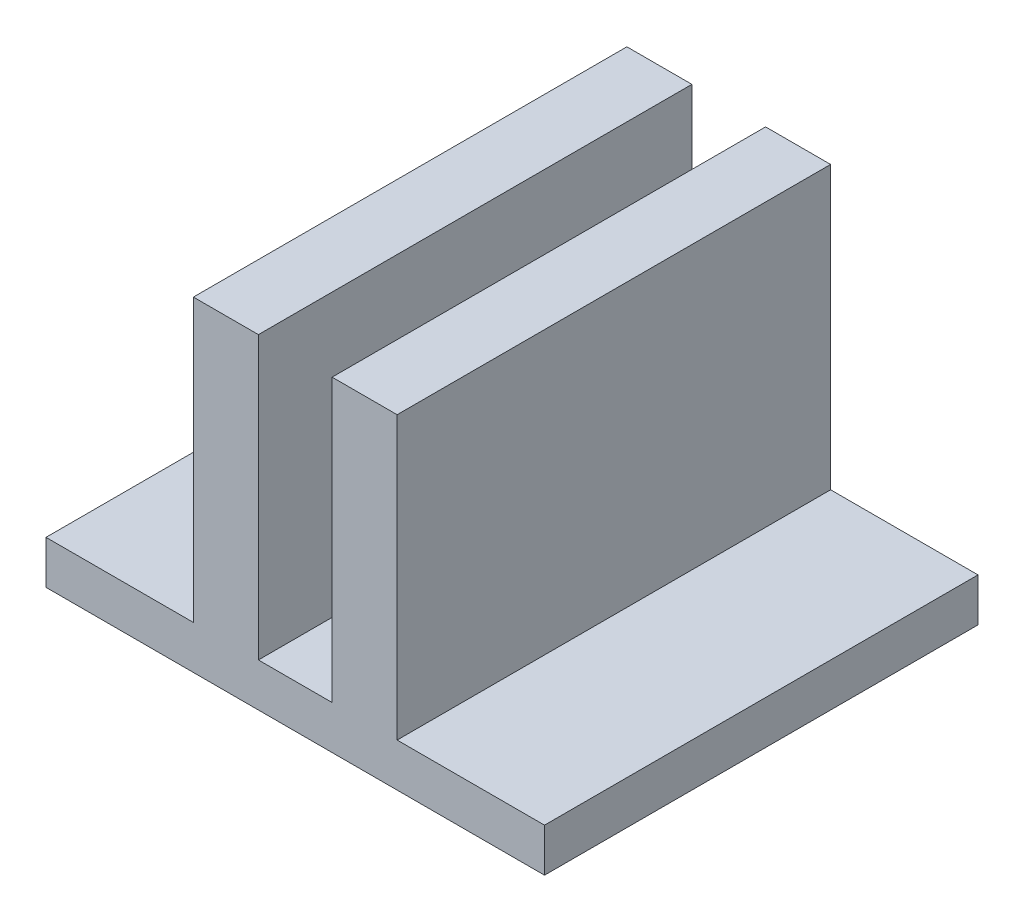
ISO-10303-21;
HEADER;
FILE_DESCRIPTION(('STEP AP214'),'2;1');
FILE_NAME('part.step','',(''),(''),'','','');
FILE_SCHEMA(('AUTOMOTIVE_DESIGN { 1 0 10303 214 1 1 1 1 }'));
ENDSEC;
DATA;
#1=APPLICATION_CONTEXT('core data for automotive mechanical design processes');
#2=APPLICATION_PROTOCOL_DEFINITION('international standard','automotive_design',2000,#1);
#3=PRODUCT_CONTEXT('',#1,'mechanical');
#4=PRODUCT('Part','Part','',(#3));
#5=PRODUCT_RELATED_PRODUCT_CATEGORY('part','',(#4));
#6=PRODUCT_DEFINITION_FORMATION('','',#4);
#7=PRODUCT_DEFINITION_CONTEXT('part definition',#1,'design');
#8=PRODUCT_DEFINITION('design','',#6,#7);
#9=PRODUCT_DEFINITION_SHAPE('','',#8);
#10=(LENGTH_UNIT() NAMED_UNIT(*) SI_UNIT(.MILLI.,.METRE.));
#11=(NAMED_UNIT(*) PLANE_ANGLE_UNIT() SI_UNIT($,.RADIAN.));
#12=(NAMED_UNIT(*) SI_UNIT($,.STERADIAN.) SOLID_ANGLE_UNIT());
#13=UNCERTAINTY_MEASURE_WITH_UNIT(LENGTH_MEASURE(1.E-05),#10,'distance_accuracy_value','');
#14=(GEOMETRIC_REPRESENTATION_CONTEXT(3) GLOBAL_UNCERTAINTY_ASSIGNED_CONTEXT((#13)) GLOBAL_UNIT_ASSIGNED_CONTEXT((#10,
#11,#12)) REPRESENTATION_CONTEXT('',''));
#15=CARTESIAN_POINT('',(0.,0.,0.));
#16=DIRECTION('',(0.,0.,1.));
#17=DIRECTION('',(1.,0.,0.));
#18=AXIS2_PLACEMENT_3D('',#15,#16,#17);
#19=CARTESIAN_POINT('',(0.,15.,0.));
#20=DIRECTION('',(0.,-1.,0.));
#21=DIRECTION('',(0.,0.,-1.));
#22=AXIS2_PLACEMENT_3D('',#19,#20,#21);
#23=PLANE('',#22);
#24=DIRECTION('',(0.,0.,1.));
#25=VECTOR('',#24,1.);
#26=CARTESIAN_POINT('',(-3.59285714285714,15.,-11.1607142857143));
#27=LINE('',#26,#25);
#28=CARTESIAN_POINT('',(-3.59285714285714,15.,-11.1607142857143));
#29=VERTEX_POINT('',#28);
#30=CARTESIAN_POINT('',(-3.59285714285714,15.,8.83928571428572));
#31=VERTEX_POINT('',#30);
#32=EDGE_CURVE('E162',#29,#31,#27,.T.);
#33=ORIENTED_EDGE('',*,*,#32,.F.);
#34=DIRECTION('',(-1.,0.,0.));
#35=VECTOR('',#34,1.);
#36=CARTESIAN_POINT('',(-8.39285714285714,15.,-11.1607142857143));
#37=LINE('',#36,#35);
#38=CARTESIAN_POINT('',(-6.59285714285714,15.,-11.1607142857143));
#39=VERTEX_POINT('',#38);
#40=EDGE_CURVE('E44',#29,#39,#37,.T.);
#41=ORIENTED_EDGE('',*,*,#40,.T.);
#42=DIRECTION('',(0.,0.,-1.));
#43=VECTOR('',#42,1.);
#44=CARTESIAN_POINT('',(-6.59285714285714,15.,8.83928571428572));
#45=LINE('',#44,#43);
#46=CARTESIAN_POINT('',(-6.59285714285714,15.,8.83928571428572));
#47=VERTEX_POINT('',#46);
#48=EDGE_CURVE('E138',#47,#39,#45,.T.);
#49=ORIENTED_EDGE('',*,*,#48,.F.);
#50=DIRECTION('',(1.,0.,0.));
#51=VECTOR('',#50,1.);
#52=CARTESIAN_POINT('',(4.60714285714286,15.,8.83928571428572));
#53=LINE('',#52,#51);
#54=EDGE_CURVE('E127',#47,#31,#53,.T.);
#55=ORIENTED_EDGE('',*,*,#54,.T.);
#56=EDGE_LOOP('',(#33,#41,#49,#55));
#57=FACE_BOUND('',#56,.T.);
#58=ADVANCED_FACE('F35',(#57),#23,.F.);
#59=DIRECTION('',(0.,0.,-1.));
#60=VECTOR('',#59,1.);
#61=CARTESIAN_POINT('',(-0.192857142857143,15.,8.83928571428572));
#62=LINE('',#61,#60);
#63=CARTESIAN_POINT('',(-0.192857142857143,15.,8.83928571428572));
#64=VERTEX_POINT('',#63);
#65=CARTESIAN_POINT('',(-0.192857142857143,15.,-11.1607142857143));
#66=VERTEX_POINT('',#65);
#67=EDGE_CURVE('E170',#64,#66,#62,.T.);
#68=ORIENTED_EDGE('',*,*,#67,.F.);
#69=CARTESIAN_POINT('',(2.80714285714286,15.,8.83928571428572));
#70=VERTEX_POINT('',#69);
#71=EDGE_CURVE('E135',#64,#70,#53,.T.);
#72=ORIENTED_EDGE('',*,*,#71,.T.);
#73=DIRECTION('',(0.,0.,1.));
#74=VECTOR('',#73,1.);
#75=CARTESIAN_POINT('',(2.80714285714286,15.,-11.1607142857143));
#76=LINE('',#75,#74);
#77=CARTESIAN_POINT('',(2.80714285714286,15.,-11.1607142857143));
#78=VERTEX_POINT('',#77);
#79=EDGE_CURVE('E153',#78,#70,#76,.T.);
#80=ORIENTED_EDGE('',*,*,#79,.F.);
#81=EDGE_CURVE('E11',#78,#66,#37,.T.);
#82=ORIENTED_EDGE('',*,*,#81,.T.);
#83=EDGE_LOOP('',(#68,#72,#80,#82));
#84=FACE_BOUND('',#83,.T.);
#85=ADVANCED_FACE('F238',(#84),#23,.F.);
#86=CARTESIAN_POINT('',(4.60714285714286,15.,8.83928571428572));
#87=DIRECTION('',(0.,0.,-1.));
#88=DIRECTION('',(-1.,0.,0.));
#89=AXIS2_PLACEMENT_3D('',#86,#87,#88);
#90=PLANE('',#89);
#91=ORIENTED_EDGE('',*,*,#54,.F.);
#92=DIRECTION('',(0.,1.,0.));
#93=VECTOR('',#92,1.);
#94=CARTESIAN_POINT('',(-6.59285714285714,2.,8.83928571428572));
#95=LINE('',#94,#93);
#96=CARTESIAN_POINT('',(-6.59285714285714,2.,8.83928571428572));
#97=VERTEX_POINT('',#96);
#98=EDGE_CURVE('E130',#97,#47,#95,.T.);
#99=ORIENTED_EDGE('',*,*,#98,.F.);
#100=DIRECTION('',(1.,0.,0.));
#101=VECTOR('',#100,1.);
#102=CARTESIAN_POINT('',(0.,2.,8.83928571428572));
#103=LINE('',#102,#101);
#104=CARTESIAN_POINT('',(-13.3928571428571,2.,8.83928571428572));
#105=VERTEX_POINT('',#104);
#106=EDGE_CURVE('E205',#105,#97,#103,.T.);
#107=ORIENTED_EDGE('',*,*,#106,.F.);
#108=DIRECTION('',(0.,1.,0.));
#109=VECTOR('',#108,1.);
#110=CARTESIAN_POINT('',(-13.3928571428571,0.,8.83928571428572));
#111=LINE('',#110,#109);
#112=CARTESIAN_POINT('',(-13.3928571428571,0.,8.83928571428572));
#113=VERTEX_POINT('',#112);
#114=EDGE_CURVE('E190',#113,#105,#111,.T.);
#115=ORIENTED_EDGE('',*,*,#114,.F.);
#116=DIRECTION('',(1.,0.,0.));
#117=VECTOR('',#116,1.);
#118=CARTESIAN_POINT('',(4.60714285714286,0.,8.83928571428572));
#119=LINE('',#118,#117);
#120=CARTESIAN_POINT('',(9.60714285714286,0.,8.83928571428572));
#121=VERTEX_POINT('',#120);
#122=EDGE_CURVE('E208',#113,#121,#119,.T.);
#123=ORIENTED_EDGE('',*,*,#122,.T.);
#124=DIRECTION('',(0.,-1.,0.));
#125=VECTOR('',#124,1.);
#126=CARTESIAN_POINT('',(9.60714285714286,2.,8.83928571428572));
#127=LINE('',#126,#125);
#128=CARTESIAN_POINT('',(9.60714285714286,2.,8.83928571428572));
#129=VERTEX_POINT('',#128);
#130=EDGE_CURVE('E184',#129,#121,#127,.T.);
#131=ORIENTED_EDGE('',*,*,#130,.F.);
#132=DIRECTION('',(1.,0.,0.));
#133=VECTOR('',#132,1.);
#134=CARTESIAN_POINT('',(0.,2.,8.83928571428572));
#135=LINE('',#134,#133);
#136=CARTESIAN_POINT('',(2.80714285714286,2.,8.83928571428572));
#137=VERTEX_POINT('',#136);
#138=EDGE_CURVE('E211',#137,#129,#135,.T.);
#139=ORIENTED_EDGE('',*,*,#138,.F.);
#140=DIRECTION('',(0.,-1.,0.));
#141=VECTOR('',#140,1.);
#142=CARTESIAN_POINT('',(2.80714285714286,15.,8.83928571428572));
#143=LINE('',#142,#141);
#144=EDGE_CURVE('E156',#70,#137,#143,.T.);
#145=ORIENTED_EDGE('',*,*,#144,.F.);
#146=ORIENTED_EDGE('',*,*,#71,.F.);
#147=DIRECTION('',(0.,1.,0.));
#148=VECTOR('',#147,1.);
#149=CARTESIAN_POINT('',(-0.192857142857143,2.,8.83928571428572));
#150=LINE('',#149,#148);
#151=CARTESIAN_POINT('',(-0.192857142857143,2.,8.83928571428572));
#152=VERTEX_POINT('',#151);
#153=EDGE_CURVE('E168',#152,#64,#150,.T.);
#154=ORIENTED_EDGE('',*,*,#153,.F.);
#155=DIRECTION('',(1.,0.,0.));
#156=VECTOR('',#155,1.);
#157=CARTESIAN_POINT('',(0.,2.,8.83928571428572));
#158=LINE('',#157,#156);
#159=CARTESIAN_POINT('',(-3.59285714285714,2.,8.83928571428572));
#160=VERTEX_POINT('',#159);
#161=EDGE_CURVE('E206',#160,#152,#158,.T.);
#162=ORIENTED_EDGE('',*,*,#161,.F.);
#163=DIRECTION('',(0.,-1.,0.));
#164=VECTOR('',#163,1.);
#165=CARTESIAN_POINT('',(-3.59285714285714,15.,8.83928571428572));
#166=LINE('',#165,#164);
#167=EDGE_CURVE('E132',#31,#160,#166,.T.);
#168=ORIENTED_EDGE('',*,*,#167,.F.);
#169=EDGE_LOOP('',(#91,#99,#107,#115,#123,#131,#139,#145,#146,#154,#162,#168));
#170=FACE_BOUND('',#169,.T.);
#171=ADVANCED_FACE('F37',(#170),#90,.F.);
#172=CARTESIAN_POINT('',(-8.39285714285714,15.,-11.1607142857143));
#173=DIRECTION('',(0.,0.,1.));
#174=DIRECTION('',(1.,0.,0.));
#175=AXIS2_PLACEMENT_3D('',#172,#173,#174);
#176=PLANE('',#175);
#177=DIRECTION('',(0.,-1.,0.));
#178=VECTOR('',#177,1.);
#179=CARTESIAN_POINT('',(-6.59285714285714,15.,-11.1607142857143));
#180=LINE('',#179,#178);
#181=CARTESIAN_POINT('',(-6.59285714285714,2.,-11.1607142857143));
#182=VERTEX_POINT('',#181);
#183=EDGE_CURVE('E143',#39,#182,#180,.T.);
#184=ORIENTED_EDGE('',*,*,#183,.F.);
#185=ORIENTED_EDGE('',*,*,#40,.F.);
#186=DIRECTION('',(0.,1.,0.));
#187=VECTOR('',#186,1.);
#188=CARTESIAN_POINT('',(-3.59285714285714,2.,-11.1607142857143));
#189=LINE('',#188,#187);
#190=CARTESIAN_POINT('',(-3.59285714285714,2.,-11.1607142857143));
#191=VERTEX_POINT('',#190);
#192=EDGE_CURVE('E160',#191,#29,#189,.T.);
#193=ORIENTED_EDGE('',*,*,#192,.F.);
#194=DIRECTION('',(-1.,0.,0.));
#195=VECTOR('',#194,1.);
#196=CARTESIAN_POINT('',(0.,2.,-11.1607142857143));
#197=LINE('',#196,#195);
#198=CARTESIAN_POINT('',(-0.192857142857143,2.,-11.1607142857143));
#199=VERTEX_POINT('',#198);
#200=EDGE_CURVE('E209',#199,#191,#197,.T.);
#201=ORIENTED_EDGE('',*,*,#200,.F.);
#202=DIRECTION('',(0.,-1.,0.));
#203=VECTOR('',#202,1.);
#204=CARTESIAN_POINT('',(-0.192857142857143,15.,-11.1607142857143));
#205=LINE('',#204,#203);
#206=EDGE_CURVE('E172',#66,#199,#205,.T.);
#207=ORIENTED_EDGE('',*,*,#206,.F.);
#208=ORIENTED_EDGE('',*,*,#81,.F.);
#209=DIRECTION('',(0.,1.,0.));
#210=VECTOR('',#209,1.);
#211=CARTESIAN_POINT('',(2.80714285714286,2.,-11.1607142857143));
#212=LINE('',#211,#210);
#213=CARTESIAN_POINT('',(2.80714285714286,2.,-11.1607142857143));
#214=VERTEX_POINT('',#213);
#215=EDGE_CURVE('E150',#214,#78,#212,.T.);
#216=ORIENTED_EDGE('',*,*,#215,.F.);
#217=DIRECTION('',(-1.,0.,0.));
#218=VECTOR('',#217,1.);
#219=CARTESIAN_POINT('',(0.,2.,-11.1607142857143));
#220=LINE('',#219,#218);
#221=CARTESIAN_POINT('',(9.60714285714286,2.,-11.1607142857143));
#222=VERTEX_POINT('',#221);
#223=EDGE_CURVE('E202',#222,#214,#220,.T.);
#224=ORIENTED_EDGE('',*,*,#223,.F.);
#225=DIRECTION('',(0.,1.,0.));
#226=VECTOR('',#225,1.);
#227=CARTESIAN_POINT('',(9.60714285714286,0.,-11.1607142857143));
#228=LINE('',#227,#226);
#229=CARTESIAN_POINT('',(9.60714285714286,0.,-11.1607142857143));
#230=VERTEX_POINT('',#229);
#231=EDGE_CURVE('E178',#230,#222,#228,.T.);
#232=ORIENTED_EDGE('',*,*,#231,.F.);
#233=DIRECTION('',(-1.,0.,0.));
#234=VECTOR('',#233,1.);
#235=CARTESIAN_POINT('',(-8.39285714285714,0.,-11.1607142857143));
#236=LINE('',#235,#234);
#237=CARTESIAN_POINT('',(-13.3928571428571,0.,-11.1607142857143));
#238=VERTEX_POINT('',#237);
#239=EDGE_CURVE('E39',#230,#238,#236,.T.);
#240=ORIENTED_EDGE('',*,*,#239,.T.);
#241=DIRECTION('',(0.,-1.,0.));
#242=VECTOR('',#241,1.);
#243=CARTESIAN_POINT('',(-13.3928571428571,2.,-11.1607142857143));
#244=LINE('',#243,#242);
#245=CARTESIAN_POINT('',(-13.3928571428571,2.,-11.1607142857143));
#246=VERTEX_POINT('',#245);
#247=EDGE_CURVE('E196',#246,#238,#244,.T.);
#248=ORIENTED_EDGE('',*,*,#247,.F.);
#249=DIRECTION('',(-1.,0.,0.));
#250=VECTOR('',#249,1.);
#251=CARTESIAN_POINT('',(0.,2.,-11.1607142857143));
#252=LINE('',#251,#250);
#253=EDGE_CURVE('E203',#182,#246,#252,.T.);
#254=ORIENTED_EDGE('',*,*,#253,.F.);
#255=EDGE_LOOP('',(#184,#185,#193,#201,#207,#208,#216,#224,#232,#240,#248,#254));
#256=FACE_BOUND('',#255,.T.);
#257=ADVANCED_FACE('F219',(#256),#176,.F.);
#258=CARTESIAN_POINT('',(0.,0.,0.));
#259=DIRECTION('',(0.,-1.,0.));
#260=DIRECTION('',(0.,0.,-1.));
#261=AXIS2_PLACEMENT_3D('',#258,#259,#260);
#262=PLANE('',#261);
#263=ORIENTED_EDGE('',*,*,#122,.F.);
#264=DIRECTION('',(0.,0.,1.));
#265=VECTOR('',#264,1.);
#266=CARTESIAN_POINT('',(-13.3928571428571,0.,-11.1607142857143));
#267=LINE('',#266,#265);
#268=EDGE_CURVE('E199',#238,#113,#267,.T.);
#269=ORIENTED_EDGE('',*,*,#268,.F.);
#270=ORIENTED_EDGE('',*,*,#239,.F.);
#271=DIRECTION('',(0.,0.,-1.));
#272=VECTOR('',#271,1.);
#273=CARTESIAN_POINT('',(9.60714285714286,0.,8.83928571428572));
#274=LINE('',#273,#272);
#275=EDGE_CURVE('E187',#121,#230,#274,.T.);
#276=ORIENTED_EDGE('',*,*,#275,.F.);
#277=EDGE_LOOP('',(#263,#269,#270,#276));
#278=FACE_BOUND('',#277,.T.);
#279=ADVANCED_FACE('F226',(#278),#262,.T.);
#280=CARTESIAN_POINT('',(0.,2.,0.));
#281=DIRECTION('',(0.,1.,0.));
#282=DIRECTION('',(0.,0.,1.));
#283=AXIS2_PLACEMENT_3D('',#280,#281,#282);
#284=PLANE('',#283);
#285=DIRECTION('',(0.,0.,-1.));
#286=VECTOR('',#285,1.);
#287=CARTESIAN_POINT('',(2.80714285714286,2.,8.83928571428572));
#288=LINE('',#287,#286);
#289=EDGE_CURVE('E60',#137,#214,#288,.T.);
#290=ORIENTED_EDGE('',*,*,#289,.F.);
#291=ORIENTED_EDGE('',*,*,#138,.T.);
#292=DIRECTION('',(0.,0.,1.));
#293=VECTOR('',#292,1.);
#294=CARTESIAN_POINT('',(9.60714285714286,2.,-11.1607142857143));
#295=LINE('',#294,#293);
#296=EDGE_CURVE('E181',#222,#129,#295,.T.);
#297=ORIENTED_EDGE('',*,*,#296,.F.);
#298=ORIENTED_EDGE('',*,*,#223,.T.);
#299=EDGE_LOOP('',(#290,#291,#297,#298));
#300=FACE_BOUND('',#299,.T.);
#301=ADVANCED_FACE('F260',(#300),#284,.T.);
#302=CARTESIAN_POINT('',(0.,2.,0.));
#303=DIRECTION('',(0.,1.,0.));
#304=DIRECTION('',(0.,0.,1.));
#305=AXIS2_PLACEMENT_3D('',#302,#303,#304);
#306=PLANE('',#305);
#307=ORIENTED_EDGE('',*,*,#161,.T.);
#308=DIRECTION('',(0.,0.,1.));
#309=VECTOR('',#308,1.);
#310=CARTESIAN_POINT('',(-0.192857142857143,2.,-11.1607142857143));
#311=LINE('',#310,#309);
#312=EDGE_CURVE('E175',#199,#152,#311,.T.);
#313=ORIENTED_EDGE('',*,*,#312,.F.);
#314=ORIENTED_EDGE('',*,*,#200,.T.);
#315=DIRECTION('',(0.,0.,-1.));
#316=VECTOR('',#315,1.);
#317=CARTESIAN_POINT('',(-3.59285714285714,2.,8.83928571428572));
#318=LINE('',#317,#316);
#319=EDGE_CURVE('E165',#160,#191,#318,.T.);
#320=ORIENTED_EDGE('',*,*,#319,.F.);
#321=EDGE_LOOP('',(#307,#313,#314,#320));
#322=FACE_BOUND('',#321,.T.);
#323=ADVANCED_FACE('F245',(#322),#306,.T.);
#324=CARTESIAN_POINT('',(0.,2.,0.));
#325=DIRECTION('',(0.,1.,0.));
#326=DIRECTION('',(0.,0.,1.));
#327=AXIS2_PLACEMENT_3D('',#324,#325,#326);
#328=PLANE('',#327);
#329=DIRECTION('',(0.,0.,1.));
#330=VECTOR('',#329,1.);
#331=CARTESIAN_POINT('',(-6.59285714285714,2.,-11.1607142857143));
#332=LINE('',#331,#330);
#333=EDGE_CURVE('E52',#182,#97,#332,.T.);
#334=ORIENTED_EDGE('',*,*,#333,.F.);
#335=ORIENTED_EDGE('',*,*,#253,.T.);
#336=DIRECTION('',(0.,0.,-1.));
#337=VECTOR('',#336,1.);
#338=CARTESIAN_POINT('',(-13.3928571428571,2.,8.83928571428572));
#339=LINE('',#338,#337);
#340=EDGE_CURVE('E193',#105,#246,#339,.T.);
#341=ORIENTED_EDGE('',*,*,#340,.F.);
#342=ORIENTED_EDGE('',*,*,#106,.T.);
#343=EDGE_LOOP('',(#334,#335,#341,#342));
#344=FACE_BOUND('',#343,.T.);
#345=ADVANCED_FACE('F250',(#344),#328,.T.);
#346=CARTESIAN_POINT('',(-13.3928571428571,0.,0.));
#347=DIRECTION('',(-1.,0.,0.));
#348=DIRECTION('',(0.,0.,1.));
#349=AXIS2_PLACEMENT_3D('',#346,#347,#348);
#350=PLANE('',#349);
#351=ORIENTED_EDGE('',*,*,#114,.T.);
#352=ORIENTED_EDGE('',*,*,#340,.T.);
#353=ORIENTED_EDGE('',*,*,#247,.T.);
#354=ORIENTED_EDGE('',*,*,#268,.T.);
#355=EDGE_LOOP('',(#351,#352,#353,#354));
#356=FACE_BOUND('',#355,.T.);
#357=ADVANCED_FACE('F224',(#356),#350,.T.);
#358=CARTESIAN_POINT('',(9.60714285714286,0.,0.));
#359=DIRECTION('',(1.,0.,0.));
#360=DIRECTION('',(0.,0.,-1.));
#361=AXIS2_PLACEMENT_3D('',#358,#359,#360);
#362=PLANE('',#361);
#363=ORIENTED_EDGE('',*,*,#231,.T.);
#364=ORIENTED_EDGE('',*,*,#296,.T.);
#365=ORIENTED_EDGE('',*,*,#130,.T.);
#366=ORIENTED_EDGE('',*,*,#275,.T.);
#367=EDGE_LOOP('',(#363,#364,#365,#366));
#368=FACE_BOUND('',#367,.T.);
#369=ADVANCED_FACE('F228',(#368),#362,.T.);
#370=CARTESIAN_POINT('',(-0.192857142857143,0.,0.));
#371=DIRECTION('',(-1.,0.,0.));
#372=DIRECTION('',(0.,0.,1.));
#373=AXIS2_PLACEMENT_3D('',#370,#371,#372);
#374=PLANE('',#373);
#375=ORIENTED_EDGE('',*,*,#153,.T.);
#376=ORIENTED_EDGE('',*,*,#67,.T.);
#377=ORIENTED_EDGE('',*,*,#206,.T.);
#378=ORIENTED_EDGE('',*,*,#312,.T.);
#379=EDGE_LOOP('',(#375,#376,#377,#378));
#380=FACE_BOUND('',#379,.T.);
#381=ADVANCED_FACE('F241',(#380),#374,.T.);
#382=CARTESIAN_POINT('',(-3.59285714285714,0.,0.));
#383=DIRECTION('',(1.,0.,0.));
#384=DIRECTION('',(0.,0.,-1.));
#385=AXIS2_PLACEMENT_3D('',#382,#383,#384);
#386=PLANE('',#385);
#387=ORIENTED_EDGE('',*,*,#192,.T.);
#388=ORIENTED_EDGE('',*,*,#32,.T.);
#389=ORIENTED_EDGE('',*,*,#167,.T.);
#390=ORIENTED_EDGE('',*,*,#319,.T.);
#391=EDGE_LOOP('',(#387,#388,#389,#390));
#392=FACE_BOUND('',#391,.T.);
#393=ADVANCED_FACE('F249',(#392),#386,.T.);
#394=CARTESIAN_POINT('',(2.80714285714286,0.,0.));
#395=DIRECTION('',(1.,0.,0.));
#396=DIRECTION('',(0.,0.,-1.));
#397=AXIS2_PLACEMENT_3D('',#394,#395,#396);
#398=PLANE('',#397);
#399=ORIENTED_EDGE('',*,*,#215,.T.);
#400=ORIENTED_EDGE('',*,*,#79,.T.);
#401=ORIENTED_EDGE('',*,*,#144,.T.);
#402=ORIENTED_EDGE('',*,*,#289,.T.);
#403=EDGE_LOOP('',(#399,#400,#401,#402));
#404=FACE_BOUND('',#403,.T.);
#405=ADVANCED_FACE('F233',(#404),#398,.T.);
#406=CARTESIAN_POINT('',(-6.59285714285714,0.,0.));
#407=DIRECTION('',(-1.,0.,0.));
#408=DIRECTION('',(0.,0.,1.));
#409=AXIS2_PLACEMENT_3D('',#406,#407,#408);
#410=PLANE('',#409);
#411=ORIENTED_EDGE('',*,*,#98,.T.);
#412=ORIENTED_EDGE('',*,*,#48,.T.);
#413=ORIENTED_EDGE('',*,*,#183,.T.);
#414=ORIENTED_EDGE('',*,*,#333,.T.);
#415=EDGE_LOOP('',(#411,#412,#413,#414));
#416=FACE_BOUND('',#415,.T.);
#417=ADVANCED_FACE('F145',(#416),#410,.T.);
#418=CLOSED_SHELL('',(#58,#85,#171,#257,#279,#301,#323,#345,#357,#369,#381,#393,#405,#417));
#419=MANIFOLD_SOLID_BREP('B2',#418);
#420=ADVANCED_BREP_SHAPE_REPRESENTATION('',(#18,#419),#14);
#421=SHAPE_DEFINITION_REPRESENTATION(#9,#420);
ENDSEC;
END-ISO-10303-21;
